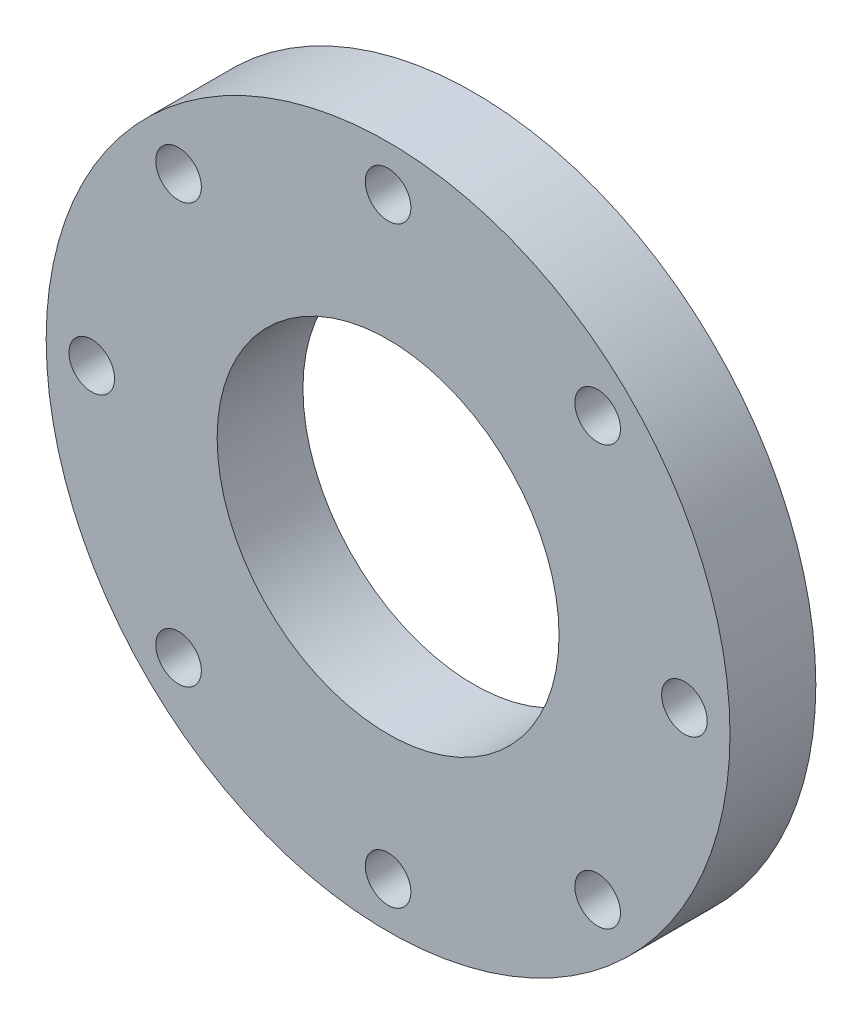
ISO-10303-21;
HEADER;
FILE_DESCRIPTION(('STEP AP214'),'2;1');
FILE_NAME('part.step','',(''),(''),'','','');
FILE_SCHEMA(('AUTOMOTIVE_DESIGN { 1 0 10303 214 1 1 1 1 }'));
ENDSEC;
DATA;
#1=APPLICATION_CONTEXT('core data for automotive mechanical design processes');
#2=APPLICATION_PROTOCOL_DEFINITION('international standard','automotive_design',2000,#1);
#3=PRODUCT_CONTEXT('',#1,'mechanical');
#4=PRODUCT('Part','Part','',(#3));
#5=PRODUCT_RELATED_PRODUCT_CATEGORY('part','',(#4));
#6=PRODUCT_DEFINITION_FORMATION('','',#4);
#7=PRODUCT_DEFINITION_CONTEXT('part definition',#1,'design');
#8=PRODUCT_DEFINITION('design','',#6,#7);
#9=PRODUCT_DEFINITION_SHAPE('','',#8);
#10=(LENGTH_UNIT() NAMED_UNIT(*) SI_UNIT(.MILLI.,.METRE.));
#11=(NAMED_UNIT(*) PLANE_ANGLE_UNIT() SI_UNIT($,.RADIAN.));
#12=(NAMED_UNIT(*) SI_UNIT($,.STERADIAN.) SOLID_ANGLE_UNIT());
#13=UNCERTAINTY_MEASURE_WITH_UNIT(LENGTH_MEASURE(1.E-05),#10,'distance_accuracy_value','');
#14=(GEOMETRIC_REPRESENTATION_CONTEXT(3) GLOBAL_UNCERTAINTY_ASSIGNED_CONTEXT((#13)) GLOBAL_UNIT_ASSIGNED_CONTEXT((#10,
#11,#12)) REPRESENTATION_CONTEXT('',''));
#15=CARTESIAN_POINT('',(0.,0.,0.));
#16=DIRECTION('',(0.,0.,1.));
#17=DIRECTION('',(1.,0.,0.));
#18=AXIS2_PLACEMENT_3D('',#15,#16,#17);
#19=CARTESIAN_POINT('',(0.,0.,7.53));
#20=DIRECTION('',(0.,0.,1.));
#21=DIRECTION('',(1.,0.,0.));
#22=AXIS2_PLACEMENT_3D('',#19,#20,#21);
#23=PLANE('',#22);
#24=CARTESIAN_POINT('',(-18.38477631085,18.3847763108505,7.53));
#25=DIRECTION('',(0.,0.,1.));
#26=DIRECTION('',(1.,0.,0.));
#27=AXIS2_PLACEMENT_3D('',#24,#25,#26);
#28=CIRCLE('',#27,2.);
#29=CARTESIAN_POINT('',(-16.38477631085,18.3847763108505,7.53));
#30=VERTEX_POINT('',#29);
#31=EDGE_CURVE('E99',#30,#30,#28,.T.);
#32=ORIENTED_EDGE('',*,*,#31,.F.);
#33=EDGE_LOOP('',(#32));
#34=FACE_BOUND('',#33,.T.);
#35=CARTESIAN_POINT('',(-26.,2.72335544429764E-13,7.53));
#36=DIRECTION('',(0.,0.,1.));
#37=DIRECTION('',(1.,0.,0.));
#38=AXIS2_PLACEMENT_3D('',#35,#36,#37);
#39=CIRCLE('',#38,2.);
#40=CARTESIAN_POINT('',(-24.,2.72335544429764E-13,7.53));
#41=VERTEX_POINT('',#40);
#42=EDGE_CURVE('E94',#41,#41,#39,.T.);
#43=ORIENTED_EDGE('',*,*,#42,.F.);
#44=EDGE_LOOP('',(#43));
#45=FACE_BOUND('',#44,.T.);
#46=CARTESIAN_POINT('',(-18.3847763108504,-18.3847763108501,7.53));
#47=DIRECTION('',(0.,0.,1.));
#48=DIRECTION('',(1.,0.,0.));
#49=AXIS2_PLACEMENT_3D('',#46,#47,#48);
#50=CIRCLE('',#49,2.);
#51=CARTESIAN_POINT('',(-16.3847763108504,-18.3847763108501,7.53));
#52=VERTEX_POINT('',#51);
#53=EDGE_CURVE('E86',#52,#52,#50,.T.);
#54=ORIENTED_EDGE('',*,*,#53,.F.);
#55=EDGE_LOOP('',(#54));
#56=FACE_BOUND('',#55,.T.);
#57=CARTESIAN_POINT('',(0.,-26.,7.53));
#58=DIRECTION('',(0.,0.,1.));
#59=DIRECTION('',(1.,0.,0.));
#60=AXIS2_PLACEMENT_3D('',#57,#58,#59);
#61=CIRCLE('',#60,2.);
#62=CARTESIAN_POINT('',(2.,-26.,7.53));
#63=VERTEX_POINT('',#62);
#64=EDGE_CURVE('E81',#63,#63,#61,.T.);
#65=ORIENTED_EDGE('',*,*,#64,.F.);
#66=EDGE_LOOP('',(#65));
#67=FACE_BOUND('',#66,.T.);
#68=CARTESIAN_POINT('',(18.3847763108501,-18.3847763108503,7.53));
#69=DIRECTION('',(0.,0.,1.));
#70=DIRECTION('',(1.,0.,0.));
#71=AXIS2_PLACEMENT_3D('',#68,#69,#70);
#72=CIRCLE('',#71,2.);
#73=CARTESIAN_POINT('',(20.3847763108501,-18.3847763108503,7.53));
#74=VERTEX_POINT('',#73);
#75=EDGE_CURVE('E77',#74,#74,#72,.T.);
#76=ORIENTED_EDGE('',*,*,#75,.F.);
#77=EDGE_LOOP('',(#76));
#78=FACE_BOUND('',#77,.T.);
#79=CARTESIAN_POINT('',(26.,0.,7.53));
#80=DIRECTION('',(0.,0.,1.));
#81=DIRECTION('',(1.,0.,0.));
#82=AXIS2_PLACEMENT_3D('',#79,#80,#81);
#83=CIRCLE('',#82,2.);
#84=CARTESIAN_POINT('',(28.,0.,7.53));
#85=VERTEX_POINT('',#84);
#86=EDGE_CURVE('E67',#85,#85,#83,.T.);
#87=ORIENTED_EDGE('',*,*,#86,.F.);
#88=EDGE_LOOP('',(#87));
#89=FACE_BOUND('',#88,.T.);
#90=CARTESIAN_POINT('',(18.3847763108503,18.3847763108502,7.53));
#91=DIRECTION('',(0.,0.,1.));
#92=DIRECTION('',(1.,0.,0.));
#93=AXIS2_PLACEMENT_3D('',#90,#91,#92);
#94=CIRCLE('',#93,2.);
#95=CARTESIAN_POINT('',(20.3847763108503,18.3847763108502,7.53));
#96=VERTEX_POINT('',#95);
#97=EDGE_CURVE('E61',#96,#96,#94,.T.);
#98=ORIENTED_EDGE('',*,*,#97,.F.);
#99=EDGE_LOOP('',(#98));
#100=FACE_BOUND('',#99,.T.);
#101=CARTESIAN_POINT('',(0.,26.,7.53));
#102=DIRECTION('',(0.,0.,1.));
#103=DIRECTION('',(1.,0.,0.));
#104=AXIS2_PLACEMENT_3D('',#101,#102,#103);
#105=CIRCLE('',#104,2.);
#106=CARTESIAN_POINT('',(2.,26.,7.53));
#107=VERTEX_POINT('',#106);
#108=EDGE_CURVE('E59',#107,#107,#105,.T.);
#109=ORIENTED_EDGE('',*,*,#108,.F.);
#110=EDGE_LOOP('',(#109));
#111=FACE_BOUND('',#110,.T.);
#112=CARTESIAN_POINT('',(0.,0.,7.53));
#113=DIRECTION('',(0.,0.,1.));
#114=DIRECTION('',(1.,0.,0.));
#115=AXIS2_PLACEMENT_3D('',#112,#113,#114);
#116=CIRCLE('',#115,30.);
#117=CARTESIAN_POINT('',(30.,0.,7.53));
#118=VERTEX_POINT('',#117);
#119=EDGE_CURVE('E10',#118,#118,#116,.T.);
#120=ORIENTED_EDGE('',*,*,#119,.T.);
#121=EDGE_LOOP('',(#120));
#122=FACE_BOUND('',#121,.T.);
#123=CARTESIAN_POINT('',(0.,0.,7.53));
#124=DIRECTION('',(0.,0.,1.));
#125=DIRECTION('',(1.,0.,0.));
#126=AXIS2_PLACEMENT_3D('',#123,#124,#125);
#127=CIRCLE('',#126,15.);
#128=CARTESIAN_POINT('',(15.,0.,7.53));
#129=VERTEX_POINT('',#128);
#130=EDGE_CURVE('E48',#129,#129,#127,.T.);
#131=ORIENTED_EDGE('',*,*,#130,.F.);
#132=EDGE_LOOP('',(#131));
#133=FACE_BOUND('',#132,.T.);
#134=ADVANCED_FACE('F40',(#34,#45,#56,#67,#78,#89,#100,#111,#122,#133),#23,.T.);
#135=CARTESIAN_POINT('',(0.,0.,0.));
#136=DIRECTION('',(0.,0.,1.));
#137=DIRECTION('',(1.,0.,0.));
#138=AXIS2_PLACEMENT_3D('',#135,#136,#137);
#139=PLANE('',#138);
#140=CARTESIAN_POINT('',(-18.38477631085,18.3847763108505,0.));
#141=DIRECTION('',(0.,0.,1.));
#142=DIRECTION('',(1.,0.,0.));
#143=AXIS2_PLACEMENT_3D('',#140,#141,#142);
#144=CIRCLE('',#143,2.);
#145=CARTESIAN_POINT('',(-16.38477631085,18.3847763108505,0.));
#146=VERTEX_POINT('',#145);
#147=EDGE_CURVE('E100',#146,#146,#144,.T.);
#148=ORIENTED_EDGE('',*,*,#147,.T.);
#149=EDGE_LOOP('',(#148));
#150=FACE_BOUND('',#149,.T.);
#151=CARTESIAN_POINT('',(-26.,2.72335544429764E-13,0.));
#152=DIRECTION('',(0.,0.,1.));
#153=DIRECTION('',(1.,0.,0.));
#154=AXIS2_PLACEMENT_3D('',#151,#152,#153);
#155=CIRCLE('',#154,2.);
#156=CARTESIAN_POINT('',(-24.,2.72335544429764E-13,0.));
#157=VERTEX_POINT('',#156);
#158=EDGE_CURVE('E93',#157,#157,#155,.T.);
#159=ORIENTED_EDGE('',*,*,#158,.T.);
#160=EDGE_LOOP('',(#159));
#161=FACE_BOUND('',#160,.T.);
#162=CARTESIAN_POINT('',(-18.3847763108504,-18.3847763108501,0.));
#163=DIRECTION('',(0.,0.,1.));
#164=DIRECTION('',(1.,0.,0.));
#165=AXIS2_PLACEMENT_3D('',#162,#163,#164);
#166=CIRCLE('',#165,2.);
#167=CARTESIAN_POINT('',(-16.3847763108504,-18.3847763108501,0.));
#168=VERTEX_POINT('',#167);
#169=EDGE_CURVE('E82',#168,#168,#166,.T.);
#170=ORIENTED_EDGE('',*,*,#169,.T.);
#171=EDGE_LOOP('',(#170));
#172=FACE_BOUND('',#171,.T.);
#173=CARTESIAN_POINT('',(0.,-26.,0.));
#174=DIRECTION('',(0.,0.,1.));
#175=DIRECTION('',(1.,0.,0.));
#176=AXIS2_PLACEMENT_3D('',#173,#174,#175);
#177=CIRCLE('',#176,2.);
#178=CARTESIAN_POINT('',(2.,-26.,0.));
#179=VERTEX_POINT('',#178);
#180=EDGE_CURVE('E76',#179,#179,#177,.T.);
#181=ORIENTED_EDGE('',*,*,#180,.T.);
#182=EDGE_LOOP('',(#181));
#183=FACE_BOUND('',#182,.T.);
#184=CARTESIAN_POINT('',(18.3847763108501,-18.3847763108503,0.));
#185=DIRECTION('',(0.,0.,1.));
#186=DIRECTION('',(1.,0.,0.));
#187=AXIS2_PLACEMENT_3D('',#184,#185,#186);
#188=CIRCLE('',#187,2.);
#189=CARTESIAN_POINT('',(20.3847763108501,-18.3847763108503,0.));
#190=VERTEX_POINT('',#189);
#191=EDGE_CURVE('E71',#190,#190,#188,.T.);
#192=ORIENTED_EDGE('',*,*,#191,.T.);
#193=EDGE_LOOP('',(#192));
#194=FACE_BOUND('',#193,.T.);
#195=CARTESIAN_POINT('',(26.,0.,0.));
#196=DIRECTION('',(0.,0.,1.));
#197=DIRECTION('',(1.,0.,0.));
#198=AXIS2_PLACEMENT_3D('',#195,#196,#197);
#199=CIRCLE('',#198,2.);
#200=CARTESIAN_POINT('',(28.,0.,0.));
#201=VERTEX_POINT('',#200);
#202=EDGE_CURVE('E66',#201,#201,#199,.T.);
#203=ORIENTED_EDGE('',*,*,#202,.T.);
#204=EDGE_LOOP('',(#203));
#205=FACE_BOUND('',#204,.T.);
#206=CARTESIAN_POINT('',(18.3847763108503,18.3847763108502,0.));
#207=DIRECTION('',(0.,0.,1.));
#208=DIRECTION('',(1.,0.,0.));
#209=AXIS2_PLACEMENT_3D('',#206,#207,#208);
#210=CIRCLE('',#209,2.);
#211=CARTESIAN_POINT('',(20.3847763108503,18.3847763108502,0.));
#212=VERTEX_POINT('',#211);
#213=EDGE_CURVE('E62',#212,#212,#210,.T.);
#214=ORIENTED_EDGE('',*,*,#213,.T.);
#215=EDGE_LOOP('',(#214));
#216=FACE_BOUND('',#215,.T.);
#217=CARTESIAN_POINT('',(0.,26.,0.));
#218=DIRECTION('',(0.,0.,1.));
#219=DIRECTION('',(1.,0.,0.));
#220=AXIS2_PLACEMENT_3D('',#217,#218,#219);
#221=CIRCLE('',#220,2.);
#222=CARTESIAN_POINT('',(2.,26.,0.));
#223=VERTEX_POINT('',#222);
#224=EDGE_CURVE('E52',#223,#223,#221,.T.);
#225=ORIENTED_EDGE('',*,*,#224,.T.);
#226=EDGE_LOOP('',(#225));
#227=FACE_BOUND('',#226,.T.);
#228=CARTESIAN_POINT('',(0.,0.,0.));
#229=DIRECTION('',(0.,0.,1.));
#230=DIRECTION('',(1.,0.,0.));
#231=AXIS2_PLACEMENT_3D('',#228,#229,#230);
#232=CIRCLE('',#231,30.);
#233=CARTESIAN_POINT('',(30.,0.,0.));
#234=VERTEX_POINT('',#233);
#235=EDGE_CURVE('E41',#234,#234,#232,.T.);
#236=ORIENTED_EDGE('',*,*,#235,.F.);
#237=EDGE_LOOP('',(#236));
#238=FACE_BOUND('',#237,.T.);
#239=CARTESIAN_POINT('',(0.,0.,0.));
#240=DIRECTION('',(0.,0.,1.));
#241=DIRECTION('',(1.,0.,0.));
#242=AXIS2_PLACEMENT_3D('',#239,#240,#241);
#243=CIRCLE('',#242,15.);
#244=CARTESIAN_POINT('',(15.,0.,0.));
#245=VERTEX_POINT('',#244);
#246=EDGE_CURVE('E49',#245,#245,#243,.T.);
#247=ORIENTED_EDGE('',*,*,#246,.T.);
#248=EDGE_LOOP('',(#247));
#249=FACE_BOUND('',#248,.T.);
#250=ADVANCED_FACE('F107',(#150,#161,#172,#183,#194,#205,#216,#227,#238,#249),#139,.F.);
#251=CARTESIAN_POINT('',(0.,0.,7.53));
#252=DIRECTION('',(0.,0.,-1.));
#253=DIRECTION('',(-1.,0.,0.));
#254=AXIS2_PLACEMENT_3D('',#251,#252,#253);
#255=CYLINDRICAL_SURFACE('',#254,30.);
#256=ORIENTED_EDGE('',*,*,#119,.F.);
#257=EDGE_LOOP('',(#256));
#258=FACE_BOUND('',#257,.T.);
#259=ORIENTED_EDGE('',*,*,#235,.T.);
#260=EDGE_LOOP('',(#259));
#261=FACE_BOUND('',#260,.T.);
#262=ADVANCED_FACE('F39',(#258,#261),#255,.T.);
#263=CARTESIAN_POINT('',(0.,0.,7.53));
#264=DIRECTION('',(0.,0.,-1.));
#265=DIRECTION('',(-1.,0.,0.));
#266=AXIS2_PLACEMENT_3D('',#263,#264,#265);
#267=CYLINDRICAL_SURFACE('',#266,15.);
#268=ORIENTED_EDGE('',*,*,#130,.T.);
#269=EDGE_LOOP('',(#268));
#270=FACE_BOUND('',#269,.T.);
#271=ORIENTED_EDGE('',*,*,#246,.F.);
#272=EDGE_LOOP('',(#271));
#273=FACE_BOUND('',#272,.T.);
#274=ADVANCED_FACE('F127',(#270,#273),#267,.F.);
#275=CARTESIAN_POINT('',(0.,26.,7.53));
#276=DIRECTION('',(0.,0.,1.));
#277=DIRECTION('',(1.,0.,0.));
#278=AXIS2_PLACEMENT_3D('',#275,#276,#277);
#279=CYLINDRICAL_SURFACE('',#278,2.);
#280=ORIENTED_EDGE('',*,*,#224,.F.);
#281=EDGE_LOOP('',(#280));
#282=FACE_BOUND('',#281,.T.);
#283=ORIENTED_EDGE('',*,*,#108,.T.);
#284=EDGE_LOOP('',(#283));
#285=FACE_BOUND('',#284,.T.);
#286=ADVANCED_FACE('F129',(#282,#285),#279,.F.);
#287=CARTESIAN_POINT('',(18.3847763108503,18.3847763108502,7.53));
#288=DIRECTION('',(0.,0.,1.));
#289=DIRECTION('',(1.,0.,0.));
#290=AXIS2_PLACEMENT_3D('',#287,#288,#289);
#291=CYLINDRICAL_SURFACE('',#290,2.);
#292=ORIENTED_EDGE('',*,*,#213,.F.);
#293=EDGE_LOOP('',(#292));
#294=FACE_BOUND('',#293,.T.);
#295=ORIENTED_EDGE('',*,*,#97,.T.);
#296=EDGE_LOOP('',(#295));
#297=FACE_BOUND('',#296,.T.);
#298=ADVANCED_FACE('F145',(#294,#297),#291,.F.);
#299=CARTESIAN_POINT('',(26.,0.,7.53));
#300=DIRECTION('',(0.,0.,1.));
#301=DIRECTION('',(1.,0.,0.));
#302=AXIS2_PLACEMENT_3D('',#299,#300,#301);
#303=CYLINDRICAL_SURFACE('',#302,2.);
#304=ORIENTED_EDGE('',*,*,#202,.F.);
#305=EDGE_LOOP('',(#304));
#306=FACE_BOUND('',#305,.T.);
#307=ORIENTED_EDGE('',*,*,#86,.T.);
#308=EDGE_LOOP('',(#307));
#309=FACE_BOUND('',#308,.T.);
#310=ADVANCED_FACE('F150',(#306,#309),#303,.F.);
#311=CARTESIAN_POINT('',(18.3847763108501,-18.3847763108503,7.53));
#312=DIRECTION('',(0.,0.,1.));
#313=DIRECTION('',(1.,0.,0.));
#314=AXIS2_PLACEMENT_3D('',#311,#312,#313);
#315=CYLINDRICAL_SURFACE('',#314,2.);
#316=ORIENTED_EDGE('',*,*,#191,.F.);
#317=EDGE_LOOP('',(#316));
#318=FACE_BOUND('',#317,.T.);
#319=ORIENTED_EDGE('',*,*,#75,.T.);
#320=EDGE_LOOP('',(#319));
#321=FACE_BOUND('',#320,.T.);
#322=ADVANCED_FACE('F151',(#318,#321),#315,.F.);
#323=CARTESIAN_POINT('',(0.,-26.,7.53));
#324=DIRECTION('',(0.,0.,1.));
#325=DIRECTION('',(1.,0.,0.));
#326=AXIS2_PLACEMENT_3D('',#323,#324,#325);
#327=CYLINDRICAL_SURFACE('',#326,2.);
#328=ORIENTED_EDGE('',*,*,#180,.F.);
#329=EDGE_LOOP('',(#328));
#330=FACE_BOUND('',#329,.T.);
#331=ORIENTED_EDGE('',*,*,#64,.T.);
#332=EDGE_LOOP('',(#331));
#333=FACE_BOUND('',#332,.T.);
#334=ADVANCED_FACE('F154',(#330,#333),#327,.F.);
#335=CARTESIAN_POINT('',(-18.3847763108504,-18.3847763108501,7.53));
#336=DIRECTION('',(0.,0.,1.));
#337=DIRECTION('',(1.,0.,0.));
#338=AXIS2_PLACEMENT_3D('',#335,#336,#337);
#339=CYLINDRICAL_SURFACE('',#338,2.);
#340=ORIENTED_EDGE('',*,*,#169,.F.);
#341=EDGE_LOOP('',(#340));
#342=FACE_BOUND('',#341,.T.);
#343=ORIENTED_EDGE('',*,*,#53,.T.);
#344=EDGE_LOOP('',(#343));
#345=FACE_BOUND('',#344,.T.);
#346=ADVANCED_FACE('F157',(#342,#345),#339,.F.);
#347=CARTESIAN_POINT('',(-26.,2.72335544429764E-13,7.53));
#348=DIRECTION('',(0.,0.,1.));
#349=DIRECTION('',(1.,0.,0.));
#350=AXIS2_PLACEMENT_3D('',#347,#348,#349);
#351=CYLINDRICAL_SURFACE('',#350,2.);
#352=ORIENTED_EDGE('',*,*,#158,.F.);
#353=EDGE_LOOP('',(#352));
#354=FACE_BOUND('',#353,.T.);
#355=ORIENTED_EDGE('',*,*,#42,.T.);
#356=EDGE_LOOP('',(#355));
#357=FACE_BOUND('',#356,.T.);
#358=ADVANCED_FACE('F162',(#354,#357),#351,.F.);
#359=CARTESIAN_POINT('',(-18.38477631085,18.3847763108505,7.53));
#360=DIRECTION('',(0.,0.,1.));
#361=DIRECTION('',(1.,0.,0.));
#362=AXIS2_PLACEMENT_3D('',#359,#360,#361);
#363=CYLINDRICAL_SURFACE('',#362,2.);
#364=ORIENTED_EDGE('',*,*,#147,.F.);
#365=EDGE_LOOP('',(#364));
#366=FACE_BOUND('',#365,.T.);
#367=ORIENTED_EDGE('',*,*,#31,.T.);
#368=EDGE_LOOP('',(#367));
#369=FACE_BOUND('',#368,.T.);
#370=ADVANCED_FACE('F102',(#366,#369),#363,.F.);
#371=CLOSED_SHELL('',(#134,#250,#262,#274,#286,#298,#310,#322,#334,#346,#358,#370));
#372=MANIFOLD_SOLID_BREP('B2',#371);
#373=ADVANCED_BREP_SHAPE_REPRESENTATION('',(#18,#372),#14);
#374=SHAPE_DEFINITION_REPRESENTATION(#9,#373);
ENDSEC;
END-ISO-10303-21;
